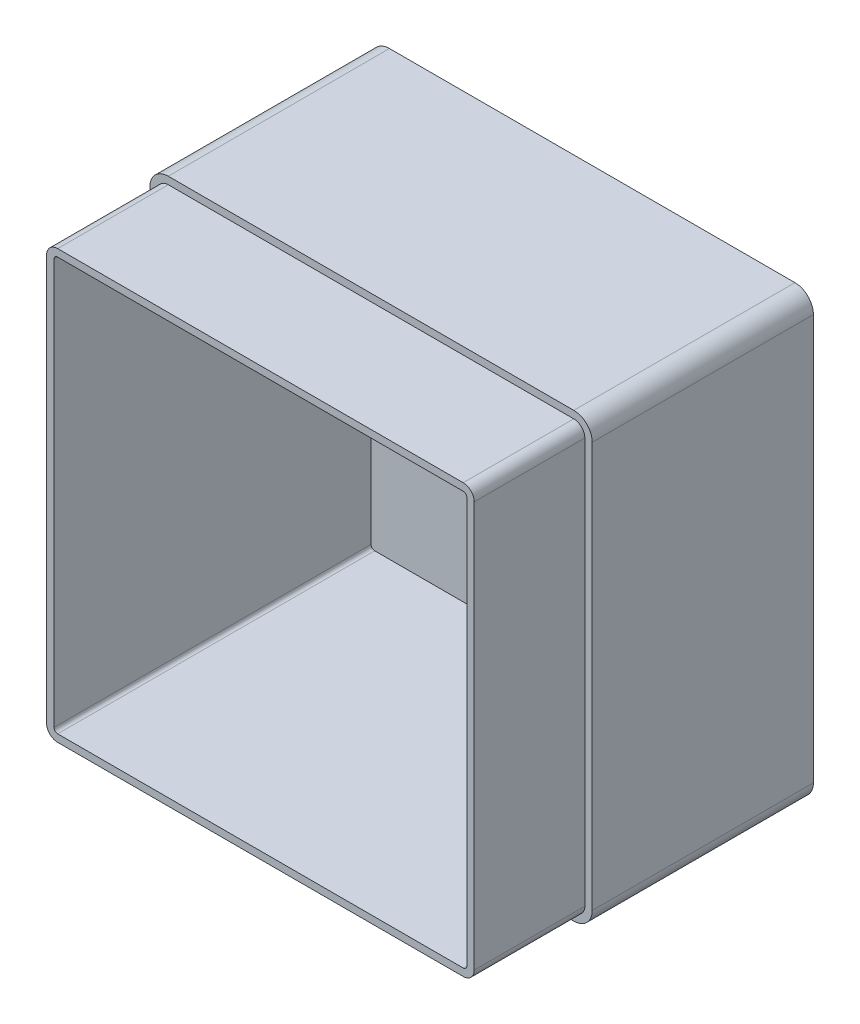
ISO-10303-21;
HEADER;
FILE_DESCRIPTION(('STEP AP214'),'2;1');
FILE_NAME('part.step','',(''),(''),'','','');
FILE_SCHEMA(('AUTOMOTIVE_DESIGN { 1 0 10303 214 1 1 1 1 }'));
ENDSEC;
DATA;
#1=APPLICATION_CONTEXT('core data for automotive mechanical design processes');
#2=APPLICATION_PROTOCOL_DEFINITION('international standard','automotive_design',2000,#1);
#3=PRODUCT_CONTEXT('',#1,'mechanical');
#4=PRODUCT('Part','Part','',(#3));
#5=PRODUCT_RELATED_PRODUCT_CATEGORY('part','',(#4));
#6=PRODUCT_DEFINITION_FORMATION('','',#4);
#7=PRODUCT_DEFINITION_CONTEXT('part definition',#1,'design');
#8=PRODUCT_DEFINITION('design','',#6,#7);
#9=PRODUCT_DEFINITION_SHAPE('','',#8);
#10=(LENGTH_UNIT() NAMED_UNIT(*) SI_UNIT(.MILLI.,.METRE.));
#11=(NAMED_UNIT(*) PLANE_ANGLE_UNIT() SI_UNIT($,.RADIAN.));
#12=(NAMED_UNIT(*) SI_UNIT($,.STERADIAN.) SOLID_ANGLE_UNIT());
#13=UNCERTAINTY_MEASURE_WITH_UNIT(LENGTH_MEASURE(1.E-05),#10,'distance_accuracy_value','');
#14=(GEOMETRIC_REPRESENTATION_CONTEXT(3) GLOBAL_UNCERTAINTY_ASSIGNED_CONTEXT((#13)) GLOBAL_UNIT_ASSIGNED_CONTEXT((#10,
#11,#12)) REPRESENTATION_CONTEXT('',''));
#15=CARTESIAN_POINT('',(0.,0.,0.));
#16=DIRECTION('',(0.,0.,1.));
#17=DIRECTION('',(1.,0.,0.));
#18=AXIS2_PLACEMENT_3D('',#15,#16,#17);
#19=CARTESIAN_POINT('',(0.,0.,90.));
#20=DIRECTION('',(0.,0.,1.));
#21=DIRECTION('',(1.,0.,0.));
#22=AXIS2_PLACEMENT_3D('',#19,#20,#21);
#23=PLANE('',#22);
#24=DIRECTION('',(1.,0.,0.));
#25=VECTOR('',#24,1.);
#26=CARTESIAN_POINT('',(-60.,-56.,90.));
#27=LINE('',#26,#25);
#28=CARTESIAN_POINT('',(-55.,-56.,90.));
#29=VERTEX_POINT('',#28);
#30=CARTESIAN_POINT('',(55.,-56.,90.));
#31=VERTEX_POINT('',#30);
#32=EDGE_CURVE('E292',#29,#31,#27,.T.);
#33=ORIENTED_EDGE('',*,*,#32,.F.);
#34=CARTESIAN_POINT('',(-55.,-55.,90.));
#35=DIRECTION('',(0.,0.,1.));
#36=DIRECTION('',(1.,0.,0.));
#37=AXIS2_PLACEMENT_3D('',#34,#35,#36);
#38=CIRCLE('',#37,1.);
#39=CARTESIAN_POINT('',(-56.,-55.,90.));
#40=VERTEX_POINT('',#39);
#41=EDGE_CURVE('E337',#40,#29,#38,.T.);
#42=ORIENTED_EDGE('',*,*,#41,.F.);
#43=DIRECTION('',(0.,-1.,0.));
#44=VECTOR('',#43,1.);
#45=CARTESIAN_POINT('',(-56.,60.,90.));
#46=LINE('',#45,#44);
#47=CARTESIAN_POINT('',(-56.,55.,90.));
#48=VERTEX_POINT('',#47);
#49=EDGE_CURVE('E335',#48,#40,#46,.T.);
#50=ORIENTED_EDGE('',*,*,#49,.F.);
#51=CARTESIAN_POINT('',(-55.,55.,90.));
#52=DIRECTION('',(0.,0.,1.));
#53=DIRECTION('',(1.,0.,0.));
#54=AXIS2_PLACEMENT_3D('',#51,#52,#53);
#55=CIRCLE('',#54,1.);
#56=CARTESIAN_POINT('',(-55.,56.,90.));
#57=VERTEX_POINT('',#56);
#58=EDGE_CURVE('E332',#57,#48,#55,.T.);
#59=ORIENTED_EDGE('',*,*,#58,.F.);
#60=DIRECTION('',(-1.,0.,0.));
#61=VECTOR('',#60,1.);
#62=CARTESIAN_POINT('',(-60.,56.,90.));
#63=LINE('',#62,#61);
#64=CARTESIAN_POINT('',(55.,56.,90.));
#65=VERTEX_POINT('',#64);
#66=EDGE_CURVE('E330',#65,#57,#63,.T.);
#67=ORIENTED_EDGE('',*,*,#66,.F.);
#68=CARTESIAN_POINT('',(55.,55.,90.));
#69=DIRECTION('',(0.,0.,1.));
#70=DIRECTION('',(1.,0.,0.));
#71=AXIS2_PLACEMENT_3D('',#68,#69,#70);
#72=CIRCLE('',#71,1.);
#73=CARTESIAN_POINT('',(56.,55.,90.));
#74=VERTEX_POINT('',#73);
#75=EDGE_CURVE('E327',#74,#65,#72,.T.);
#76=ORIENTED_EDGE('',*,*,#75,.F.);
#77=DIRECTION('',(0.,1.,0.));
#78=VECTOR('',#77,1.);
#79=CARTESIAN_POINT('',(56.,60.,90.));
#80=LINE('',#79,#78);
#81=CARTESIAN_POINT('',(56.,-55.,90.));
#82=VERTEX_POINT('',#81);
#83=EDGE_CURVE('E300',#82,#74,#80,.T.);
#84=ORIENTED_EDGE('',*,*,#83,.F.);
#85=CARTESIAN_POINT('',(55.,-55.,90.));
#86=DIRECTION('',(0.,0.,1.));
#87=DIRECTION('',(1.,0.,0.));
#88=AXIS2_PLACEMENT_3D('',#85,#86,#87);
#89=CIRCLE('',#88,1.);
#90=EDGE_CURVE('E320',#31,#82,#89,.T.);
#91=ORIENTED_EDGE('',*,*,#90,.F.);
#92=EDGE_LOOP('',(#33,#42,#50,#59,#67,#76,#84,#91));
#93=FACE_BOUND('',#92,.T.);
#94=DIRECTION('',(0.,1.,0.));
#95=VECTOR('',#94,1.);
#96=CARTESIAN_POINT('',(58.,-55.,90.));
#97=LINE('',#96,#95);
#98=CARTESIAN_POINT('',(58.,-55.,90.));
#99=VERTEX_POINT('',#98);
#100=CARTESIAN_POINT('',(58.,55.,90.));
#101=VERTEX_POINT('',#100);
#102=EDGE_CURVE('E220',#99,#101,#97,.T.);
#103=ORIENTED_EDGE('',*,*,#102,.T.);
#104=CARTESIAN_POINT('',(55.,55.,90.));
#105=DIRECTION('',(0.,0.,1.));
#106=DIRECTION('',(1.,0.,0.));
#107=AXIS2_PLACEMENT_3D('',#104,#105,#106);
#108=CIRCLE('',#107,3.);
#109=CARTESIAN_POINT('',(55.,58.,90.));
#110=VERTEX_POINT('',#109);
#111=EDGE_CURVE('E240',#101,#110,#108,.T.);
#112=ORIENTED_EDGE('',*,*,#111,.T.);
#113=DIRECTION('',(-1.,0.,0.));
#114=VECTOR('',#113,1.);
#115=CARTESIAN_POINT('',(55.,58.,90.));
#116=LINE('',#115,#114);
#117=CARTESIAN_POINT('',(-55.,58.,90.));
#118=VERTEX_POINT('',#117);
#119=EDGE_CURVE('E200',#110,#118,#116,.T.);
#120=ORIENTED_EDGE('',*,*,#119,.T.);
#121=CARTESIAN_POINT('',(-55.,55.,90.));
#122=DIRECTION('',(0.,0.,1.));
#123=DIRECTION('',(1.,0.,0.));
#124=AXIS2_PLACEMENT_3D('',#121,#122,#123);
#125=CIRCLE('',#124,2.99999999999999);
#126=CARTESIAN_POINT('',(-58.,55.,90.));
#127=VERTEX_POINT('',#126);
#128=EDGE_CURVE('E48',#118,#127,#125,.T.);
#129=ORIENTED_EDGE('',*,*,#128,.T.);
#130=DIRECTION('',(0.,-1.,0.));
#131=VECTOR('',#130,1.);
#132=CARTESIAN_POINT('',(-58.,55.,90.));
#133=LINE('',#132,#131);
#134=CARTESIAN_POINT('',(-58.,-55.,90.));
#135=VERTEX_POINT('',#134);
#136=EDGE_CURVE('E244',#127,#135,#133,.T.);
#137=ORIENTED_EDGE('',*,*,#136,.T.);
#138=CARTESIAN_POINT('',(-55.,-55.,90.));
#139=DIRECTION('',(0.,0.,1.));
#140=DIRECTION('',(1.,0.,0.));
#141=AXIS2_PLACEMENT_3D('',#138,#139,#140);
#142=CIRCLE('',#141,3.);
#143=CARTESIAN_POINT('',(-55.,-58.,90.));
#144=VERTEX_POINT('',#143);
#145=EDGE_CURVE('E247',#135,#144,#142,.T.);
#146=ORIENTED_EDGE('',*,*,#145,.T.);
#147=DIRECTION('',(1.,0.,0.));
#148=VECTOR('',#147,1.);
#149=CARTESIAN_POINT('',(-55.,-58.,90.));
#150=LINE('',#149,#148);
#151=CARTESIAN_POINT('',(55.,-58.,90.));
#152=VERTEX_POINT('',#151);
#153=EDGE_CURVE('E250',#144,#152,#150,.T.);
#154=ORIENTED_EDGE('',*,*,#153,.T.);
#155=CARTESIAN_POINT('',(55.,-55.,90.));
#156=DIRECTION('',(0.,0.,1.));
#157=DIRECTION('',(1.,0.,0.));
#158=AXIS2_PLACEMENT_3D('',#155,#156,#157);
#159=CIRCLE('',#158,3.);
#160=EDGE_CURVE('E223',#152,#99,#159,.T.);
#161=ORIENTED_EDGE('',*,*,#160,.T.);
#162=EDGE_LOOP('',(#103,#112,#120,#129,#137,#146,#154,#161));
#163=FACE_BOUND('',#162,.T.);
#164=ADVANCED_FACE('F33',(#93,#163),#23,.T.);
#165=CARTESIAN_POINT('',(56.,60.,90.));
#166=DIRECTION('',(-1.,0.,0.));
#167=DIRECTION('',(0.,-1.,0.));
#168=AXIS2_PLACEMENT_3D('',#165,#166,#167);
#169=PLANE('',#168);
#170=ORIENTED_EDGE('',*,*,#83,.T.);
#171=DIRECTION('',(0.,0.,1.));
#172=VECTOR('',#171,1.);
#173=CARTESIAN_POINT('',(56.,55.,90.));
#174=LINE('',#173,#172);
#175=CARTESIAN_POINT('',(56.,55.,4.));
#176=VERTEX_POINT('',#175);
#177=EDGE_CURVE('E287',#176,#74,#174,.T.);
#178=ORIENTED_EDGE('',*,*,#177,.F.);
#179=DIRECTION('',(0.,1.,0.));
#180=VECTOR('',#179,1.);
#181=CARTESIAN_POINT('',(56.,60.,4.));
#182=LINE('',#181,#180);
#183=CARTESIAN_POINT('',(56.,-55.,4.));
#184=VERTEX_POINT('',#183);
#185=EDGE_CURVE('E282',#184,#176,#182,.T.);
#186=ORIENTED_EDGE('',*,*,#185,.F.);
#187=DIRECTION('',(0.,0.,1.));
#188=VECTOR('',#187,1.);
#189=CARTESIAN_POINT('',(56.,-55.,90.));
#190=LINE('',#189,#188);
#191=EDGE_CURVE('E283',#82,#184,#190,.F.);
#192=ORIENTED_EDGE('',*,*,#191,.F.);
#193=EDGE_LOOP('',(#170,#178,#186,#192));
#194=FACE_BOUND('',#193,.T.);
#195=ADVANCED_FACE('F423',(#194),#169,.T.);
#196=CARTESIAN_POINT('',(-60.,56.,90.));
#197=DIRECTION('',(0.,-1.,0.));
#198=DIRECTION('',(1.,0.,0.));
#199=AXIS2_PLACEMENT_3D('',#196,#197,#198);
#200=PLANE('',#199);
#201=DIRECTION('',(-1.,0.,0.));
#202=VECTOR('',#201,1.);
#203=CARTESIAN_POINT('',(-60.,56.,4.));
#204=LINE('',#203,#202);
#205=CARTESIAN_POINT('',(55.,56.,4.));
#206=VERTEX_POINT('',#205);
#207=CARTESIAN_POINT('',(-55.,56.,4.));
#208=VERTEX_POINT('',#207);
#209=EDGE_CURVE('E290',#206,#208,#204,.T.);
#210=ORIENTED_EDGE('',*,*,#209,.F.);
#211=DIRECTION('',(0.,0.,1.));
#212=VECTOR('',#211,1.);
#213=CARTESIAN_POINT('',(55.,56.,90.));
#214=LINE('',#213,#212);
#215=EDGE_CURVE('E313',#65,#206,#214,.F.);
#216=ORIENTED_EDGE('',*,*,#215,.F.);
#217=ORIENTED_EDGE('',*,*,#66,.T.);
#218=DIRECTION('',(0.,0.,1.));
#219=VECTOR('',#218,1.);
#220=CARTESIAN_POINT('',(-55.,56.,90.));
#221=LINE('',#220,#219);
#222=EDGE_CURVE('E310',#208,#57,#221,.T.);
#223=ORIENTED_EDGE('',*,*,#222,.F.);
#224=EDGE_LOOP('',(#210,#216,#217,#223));
#225=FACE_BOUND('',#224,.T.);
#226=ADVANCED_FACE('F429',(#225),#200,.T.);
#227=CARTESIAN_POINT('',(-56.,60.,90.));
#228=DIRECTION('',(1.,0.,0.));
#229=DIRECTION('',(0.,1.,0.));
#230=AXIS2_PLACEMENT_3D('',#227,#228,#229);
#231=PLANE('',#230);
#232=DIRECTION('',(0.,-1.,0.));
#233=VECTOR('',#232,1.);
#234=CARTESIAN_POINT('',(-56.,60.,4.));
#235=LINE('',#234,#233);
#236=CARTESIAN_POINT('',(-56.,55.,4.));
#237=VERTEX_POINT('',#236);
#238=CARTESIAN_POINT('',(-56.,-55.,4.));
#239=VERTEX_POINT('',#238);
#240=EDGE_CURVE('E301',#237,#239,#235,.T.);
#241=ORIENTED_EDGE('',*,*,#240,.F.);
#242=DIRECTION('',(0.,0.,1.));
#243=VECTOR('',#242,1.);
#244=CARTESIAN_POINT('',(-56.,55.,90.));
#245=LINE('',#244,#243);
#246=EDGE_CURVE('E317',#48,#237,#245,.F.);
#247=ORIENTED_EDGE('',*,*,#246,.F.);
#248=ORIENTED_EDGE('',*,*,#49,.T.);
#249=DIRECTION('',(0.,0.,1.));
#250=VECTOR('',#249,1.);
#251=CARTESIAN_POINT('',(-56.,-55.,90.));
#252=LINE('',#251,#250);
#253=EDGE_CURVE('E316',#239,#40,#252,.T.);
#254=ORIENTED_EDGE('',*,*,#253,.F.);
#255=EDGE_LOOP('',(#241,#247,#248,#254));
#256=FACE_BOUND('',#255,.T.);
#257=ADVANCED_FACE('F618',(#256),#231,.T.);
#258=CARTESIAN_POINT('',(-60.,-56.,90.));
#259=DIRECTION('',(0.,1.,0.));
#260=DIRECTION('',(-1.,0.,0.));
#261=AXIS2_PLACEMENT_3D('',#258,#259,#260);
#262=PLANE('',#261);
#263=DIRECTION('',(1.,0.,0.));
#264=VECTOR('',#263,1.);
#265=CARTESIAN_POINT('',(-60.,-56.,4.));
#266=LINE('',#265,#264);
#267=CARTESIAN_POINT('',(-55.,-56.,4.));
#268=VERTEX_POINT('',#267);
#269=CARTESIAN_POINT('',(55.,-56.,4.));
#270=VERTEX_POINT('',#269);
#271=EDGE_CURVE('E297',#268,#270,#266,.T.);
#272=ORIENTED_EDGE('',*,*,#271,.F.);
#273=DIRECTION('',(0.,0.,1.));
#274=VECTOR('',#273,1.);
#275=CARTESIAN_POINT('',(-55.,-56.,90.));
#276=LINE('',#275,#274);
#277=EDGE_CURVE('E295',#29,#268,#276,.F.);
#278=ORIENTED_EDGE('',*,*,#277,.F.);
#279=ORIENTED_EDGE('',*,*,#32,.T.);
#280=DIRECTION('',(0.,0.,1.));
#281=VECTOR('',#280,1.);
#282=CARTESIAN_POINT('',(55.,-56.,90.));
#283=LINE('',#282,#281);
#284=EDGE_CURVE('E325',#270,#31,#283,.T.);
#285=ORIENTED_EDGE('',*,*,#284,.F.);
#286=EDGE_LOOP('',(#272,#278,#279,#285));
#287=FACE_BOUND('',#286,.T.);
#288=ADVANCED_FACE('F610',(#287),#262,.T.);
#289=CARTESIAN_POINT('',(0.,0.,4.));
#290=DIRECTION('',(0.,0.,1.));
#291=DIRECTION('',(1.,0.,0.));
#292=AXIS2_PLACEMENT_3D('',#289,#290,#291);
#293=PLANE('',#292);
#294=ORIENTED_EDGE('',*,*,#185,.T.);
#295=CARTESIAN_POINT('',(55.,55.,4.));
#296=DIRECTION('',(0.,0.,1.));
#297=DIRECTION('',(1.,0.,0.));
#298=AXIS2_PLACEMENT_3D('',#295,#296,#297);
#299=CIRCLE('',#298,1.);
#300=EDGE_CURVE('E286',#206,#176,#299,.F.);
#301=ORIENTED_EDGE('',*,*,#300,.F.);
#302=ORIENTED_EDGE('',*,*,#209,.T.);
#303=CARTESIAN_POINT('',(-55.,55.,4.));
#304=DIRECTION('',(0.,0.,1.));
#305=DIRECTION('',(1.,0.,0.));
#306=AXIS2_PLACEMENT_3D('',#303,#304,#305);
#307=CIRCLE('',#306,1.);
#308=EDGE_CURVE('E303',#237,#208,#307,.F.);
#309=ORIENTED_EDGE('',*,*,#308,.F.);
#310=ORIENTED_EDGE('',*,*,#240,.T.);
#311=CARTESIAN_POINT('',(-55.,-55.,4.));
#312=DIRECTION('',(0.,0.,1.));
#313=DIRECTION('',(1.,0.,0.));
#314=AXIS2_PLACEMENT_3D('',#311,#312,#313);
#315=CIRCLE('',#314,1.);
#316=EDGE_CURVE('E296',#268,#239,#315,.F.);
#317=ORIENTED_EDGE('',*,*,#316,.F.);
#318=ORIENTED_EDGE('',*,*,#271,.T.);
#319=CARTESIAN_POINT('',(55.,-55.,4.));
#320=DIRECTION('',(0.,0.,1.));
#321=DIRECTION('',(1.,0.,0.));
#322=AXIS2_PLACEMENT_3D('',#319,#320,#321);
#323=CIRCLE('',#322,1.);
#324=EDGE_CURVE('E293',#184,#270,#323,.F.);
#325=ORIENTED_EDGE('',*,*,#324,.F.);
#326=EDGE_LOOP('',(#294,#301,#302,#309,#310,#317,#318,#325));
#327=FACE_BOUND('',#326,.T.);
#328=ADVANCED_FACE('F602',(#327),#293,.T.);
#329=CARTESIAN_POINT('',(55.,-55.,90.));
#330=DIRECTION('',(0.,0.,-1.));
#331=DIRECTION('',(-1.,0.,0.));
#332=AXIS2_PLACEMENT_3D('',#329,#330,#331);
#333=CYLINDRICAL_SURFACE('',#332,1.);
#334=ORIENTED_EDGE('',*,*,#90,.T.);
#335=ORIENTED_EDGE('',*,*,#191,.T.);
#336=ORIENTED_EDGE('',*,*,#324,.T.);
#337=ORIENTED_EDGE('',*,*,#284,.T.);
#338=EDGE_LOOP('',(#334,#335,#336,#337));
#339=FACE_BOUND('',#338,.T.);
#340=ADVANCED_FACE('F594',(#339),#333,.F.);
#341=CARTESIAN_POINT('',(-55.,-55.,90.));
#342=DIRECTION('',(0.,0.,-1.));
#343=DIRECTION('',(-1.,0.,0.));
#344=AXIS2_PLACEMENT_3D('',#341,#342,#343);
#345=CYLINDRICAL_SURFACE('',#344,1.);
#346=ORIENTED_EDGE('',*,*,#41,.T.);
#347=ORIENTED_EDGE('',*,*,#277,.T.);
#348=ORIENTED_EDGE('',*,*,#316,.T.);
#349=ORIENTED_EDGE('',*,*,#253,.T.);
#350=EDGE_LOOP('',(#346,#347,#348,#349));
#351=FACE_BOUND('',#350,.T.);
#352=ADVANCED_FACE('F587',(#351),#345,.F.);
#353=CARTESIAN_POINT('',(-55.,55.,90.));
#354=DIRECTION('',(0.,0.,-1.));
#355=DIRECTION('',(-1.,0.,0.));
#356=AXIS2_PLACEMENT_3D('',#353,#354,#355);
#357=CYLINDRICAL_SURFACE('',#356,1.);
#358=ORIENTED_EDGE('',*,*,#58,.T.);
#359=ORIENTED_EDGE('',*,*,#246,.T.);
#360=ORIENTED_EDGE('',*,*,#308,.T.);
#361=ORIENTED_EDGE('',*,*,#222,.T.);
#362=EDGE_LOOP('',(#358,#359,#360,#361));
#363=FACE_BOUND('',#362,.T.);
#364=ADVANCED_FACE('F581',(#363),#357,.F.);
#365=CARTESIAN_POINT('',(55.,55.,90.));
#366=DIRECTION('',(0.,0.,-1.));
#367=DIRECTION('',(-1.,0.,0.));
#368=AXIS2_PLACEMENT_3D('',#365,#366,#367);
#369=CYLINDRICAL_SURFACE('',#368,1.);
#370=ORIENTED_EDGE('',*,*,#75,.T.);
#371=ORIENTED_EDGE('',*,*,#215,.T.);
#372=ORIENTED_EDGE('',*,*,#300,.T.);
#373=ORIENTED_EDGE('',*,*,#177,.T.);
#374=EDGE_LOOP('',(#370,#371,#372,#373));
#375=FACE_BOUND('',#374,.T.);
#376=ADVANCED_FACE('F436',(#375),#369,.F.);
#377=CARTESIAN_POINT('',(-55.,-55.,60.));
#378=DIRECTION('',(0.,0.,1.));
#379=DIRECTION('',(1.,0.,0.));
#380=AXIS2_PLACEMENT_3D('',#377,#378,#379);
#381=PLANE('',#380);
#382=DIRECTION('',(0.,1.,0.));
#383=VECTOR('',#382,1.);
#384=CARTESIAN_POINT('',(58.,-55.,60.));
#385=LINE('',#384,#383);
#386=CARTESIAN_POINT('',(58.,-55.,60.));
#387=VERTEX_POINT('',#386);
#388=CARTESIAN_POINT('',(58.,55.,60.));
#389=VERTEX_POINT('',#388);
#390=EDGE_CURVE('E206',#387,#389,#385,.T.);
#391=ORIENTED_EDGE('',*,*,#390,.F.);
#392=CARTESIAN_POINT('',(55.,-55.,60.));
#393=DIRECTION('',(0.,0.,1.));
#394=DIRECTION('',(1.,0.,0.));
#395=AXIS2_PLACEMENT_3D('',#392,#393,#394);
#396=CIRCLE('',#395,3.);
#397=CARTESIAN_POINT('',(55.,-58.,60.));
#398=VERTEX_POINT('',#397);
#399=EDGE_CURVE('E236',#398,#387,#396,.T.);
#400=ORIENTED_EDGE('',*,*,#399,.F.);
#401=DIRECTION('',(1.,0.,0.));
#402=VECTOR('',#401,1.);
#403=CARTESIAN_POINT('',(-55.,-58.,60.));
#404=LINE('',#403,#402);
#405=CARTESIAN_POINT('',(-55.,-58.,60.));
#406=VERTEX_POINT('',#405);
#407=EDGE_CURVE('E233',#406,#398,#404,.T.);
#408=ORIENTED_EDGE('',*,*,#407,.F.);
#409=CARTESIAN_POINT('',(-55.,-55.,60.));
#410=DIRECTION('',(0.,0.,1.));
#411=DIRECTION('',(1.,0.,0.));
#412=AXIS2_PLACEMENT_3D('',#409,#410,#411);
#413=CIRCLE('',#412,3.);
#414=CARTESIAN_POINT('',(-58.,-55.,60.));
#415=VERTEX_POINT('',#414);
#416=EDGE_CURVE('E230',#415,#406,#413,.T.);
#417=ORIENTED_EDGE('',*,*,#416,.F.);
#418=DIRECTION('',(0.,-1.,0.));
#419=VECTOR('',#418,1.);
#420=CARTESIAN_POINT('',(-58.,55.,60.));
#421=LINE('',#420,#419);
#422=CARTESIAN_POINT('',(-58.,55.,60.));
#423=VERTEX_POINT('',#422);
#424=EDGE_CURVE('E227',#423,#415,#421,.T.);
#425=ORIENTED_EDGE('',*,*,#424,.F.);
#426=CARTESIAN_POINT('',(-55.,55.,60.));
#427=DIRECTION('',(0.,0.,1.));
#428=DIRECTION('',(1.,0.,0.));
#429=AXIS2_PLACEMENT_3D('',#426,#427,#428);
#430=CIRCLE('',#429,2.99999999999999);
#431=CARTESIAN_POINT('',(-55.,58.,60.));
#432=VERTEX_POINT('',#431);
#433=EDGE_CURVE('E216',#432,#423,#430,.T.);
#434=ORIENTED_EDGE('',*,*,#433,.F.);
#435=DIRECTION('',(-1.,0.,0.));
#436=VECTOR('',#435,1.);
#437=CARTESIAN_POINT('',(55.,58.,60.));
#438=LINE('',#437,#436);
#439=CARTESIAN_POINT('',(55.,58.,60.));
#440=VERTEX_POINT('',#439);
#441=EDGE_CURVE('E198',#440,#432,#438,.T.);
#442=ORIENTED_EDGE('',*,*,#441,.F.);
#443=CARTESIAN_POINT('',(55.,55.,60.));
#444=DIRECTION('',(0.,0.,1.));
#445=DIRECTION('',(1.,0.,0.));
#446=AXIS2_PLACEMENT_3D('',#443,#444,#445);
#447=CIRCLE('',#446,3.);
#448=EDGE_CURVE('E212',#389,#440,#447,.T.);
#449=ORIENTED_EDGE('',*,*,#448,.F.);
#450=EDGE_LOOP('',(#391,#400,#408,#417,#425,#434,#442,#449));
#451=FACE_BOUND('',#450,.T.);
#452=CARTESIAN_POINT('',(-55.,-55.,60.));
#453=DIRECTION('',(0.,0.,1.));
#454=DIRECTION('',(1.,0.,0.));
#455=AXIS2_PLACEMENT_3D('',#452,#453,#454);
#456=CIRCLE('',#455,5.);
#457=CARTESIAN_POINT('',(-60.,-55.,60.));
#458=VERTEX_POINT('',#457);
#459=CARTESIAN_POINT('',(-55.,-60.,60.));
#460=VERTEX_POINT('',#459);
#461=EDGE_CURVE('E256',#458,#460,#456,.T.);
#462=ORIENTED_EDGE('',*,*,#461,.T.);
#463=DIRECTION('',(1.,0.,0.));
#464=VECTOR('',#463,1.);
#465=CARTESIAN_POINT('',(-55.,-60.,60.));
#466=LINE('',#465,#464);
#467=CARTESIAN_POINT('',(55.,-60.,60.));
#468=VERTEX_POINT('',#467);
#469=EDGE_CURVE('E269',#460,#468,#466,.T.);
#470=ORIENTED_EDGE('',*,*,#469,.T.);
#471=CARTESIAN_POINT('',(55.,-55.,60.));
#472=DIRECTION('',(0.,0.,1.));
#473=DIRECTION('',(1.,0.,0.));
#474=AXIS2_PLACEMENT_3D('',#471,#472,#473);
#475=CIRCLE('',#474,4.99999999999999);
#476=CARTESIAN_POINT('',(60.,-55.,60.));
#477=VERTEX_POINT('',#476);
#478=EDGE_CURVE('E271',#468,#477,#475,.T.);
#479=ORIENTED_EDGE('',*,*,#478,.T.);
#480=DIRECTION('',(0.,1.,0.));
#481=VECTOR('',#480,1.);
#482=CARTESIAN_POINT('',(60.,-55.,60.));
#483=LINE('',#482,#481);
#484=CARTESIAN_POINT('',(60.,55.,60.));
#485=VERTEX_POINT('',#484);
#486=EDGE_CURVE('E56',#477,#485,#483,.T.);
#487=ORIENTED_EDGE('',*,*,#486,.T.);
#488=CARTESIAN_POINT('',(55.,55.,60.));
#489=DIRECTION('',(0.,0.,1.));
#490=DIRECTION('',(1.,0.,0.));
#491=AXIS2_PLACEMENT_3D('',#488,#489,#490);
#492=CIRCLE('',#491,5.);
#493=CARTESIAN_POINT('',(55.,60.,60.));
#494=VERTEX_POINT('',#493);
#495=EDGE_CURVE('E274',#485,#494,#492,.T.);
#496=ORIENTED_EDGE('',*,*,#495,.T.);
#497=DIRECTION('',(-1.,0.,0.));
#498=VECTOR('',#497,1.);
#499=CARTESIAN_POINT('',(55.,60.,60.));
#500=LINE('',#499,#498);
#501=CARTESIAN_POINT('',(-55.,60.,60.));
#502=VERTEX_POINT('',#501);
#503=EDGE_CURVE('E276',#494,#502,#500,.T.);
#504=ORIENTED_EDGE('',*,*,#503,.T.);
#505=CARTESIAN_POINT('',(-55.,55.,60.));
#506=DIRECTION('',(0.,0.,1.));
#507=DIRECTION('',(1.,0.,0.));
#508=AXIS2_PLACEMENT_3D('',#505,#506,#507);
#509=CIRCLE('',#508,5.);
#510=CARTESIAN_POINT('',(-60.,55.,60.));
#511=VERTEX_POINT('',#510);
#512=EDGE_CURVE('E278',#502,#511,#509,.T.);
#513=ORIENTED_EDGE('',*,*,#512,.T.);
#514=DIRECTION('',(0.,-1.,0.));
#515=VECTOR('',#514,1.);
#516=CARTESIAN_POINT('',(-60.,55.,60.));
#517=LINE('',#516,#515);
#518=EDGE_CURVE('E280',#511,#458,#517,.T.);
#519=ORIENTED_EDGE('',*,*,#518,.T.);
#520=EDGE_LOOP('',(#462,#470,#479,#487,#496,#504,#513,#519));
#521=FACE_BOUND('',#520,.T.);
#522=ADVANCED_FACE('F211',(#451,#521),#381,.T.);
#523=CARTESIAN_POINT('',(55.,55.,60.));
#524=DIRECTION('',(0.,0.,1.));
#525=DIRECTION('',(1.,0.,0.));
#526=AXIS2_PLACEMENT_3D('',#523,#524,#525);
#527=CYLINDRICAL_SURFACE('',#526,3.);
#528=ORIENTED_EDGE('',*,*,#111,.F.);
#529=DIRECTION('',(0.,0.,1.));
#530=VECTOR('',#529,1.);
#531=CARTESIAN_POINT('',(58.,55.,60.));
#532=LINE('',#531,#530);
#533=EDGE_CURVE('E219',#389,#101,#532,.T.);
#534=ORIENTED_EDGE('',*,*,#533,.F.);
#535=ORIENTED_EDGE('',*,*,#448,.T.);
#536=DIRECTION('',(0.,0.,1.));
#537=VECTOR('',#536,1.);
#538=CARTESIAN_POINT('',(55.,58.,60.));
#539=LINE('',#538,#537);
#540=EDGE_CURVE('E195',#440,#110,#539,.T.);
#541=ORIENTED_EDGE('',*,*,#540,.T.);
#542=EDGE_LOOP('',(#528,#534,#535,#541));
#543=FACE_BOUND('',#542,.T.);
#544=ADVANCED_FACE('F218',(#543),#527,.T.);
#545=CARTESIAN_POINT('',(58.,-55.,60.));
#546=DIRECTION('',(1.,0.,0.));
#547=DIRECTION('',(0.,0.,-1.));
#548=AXIS2_PLACEMENT_3D('',#545,#546,#547);
#549=PLANE('',#548);
#550=ORIENTED_EDGE('',*,*,#102,.F.);
#551=DIRECTION('',(0.,0.,1.));
#552=VECTOR('',#551,1.);
#553=CARTESIAN_POINT('',(58.,-55.,60.));
#554=LINE('',#553,#552);
#555=EDGE_CURVE('E257',#387,#99,#554,.T.);
#556=ORIENTED_EDGE('',*,*,#555,.F.);
#557=ORIENTED_EDGE('',*,*,#390,.T.);
#558=ORIENTED_EDGE('',*,*,#533,.T.);
#559=EDGE_LOOP('',(#550,#556,#557,#558));
#560=FACE_BOUND('',#559,.T.);
#561=ADVANCED_FACE('F509',(#560),#549,.T.);
#562=CARTESIAN_POINT('',(55.,-55.,60.));
#563=DIRECTION('',(0.,0.,1.));
#564=DIRECTION('',(1.,0.,0.));
#565=AXIS2_PLACEMENT_3D('',#562,#563,#564);
#566=CYLINDRICAL_SURFACE('',#565,3.);
#567=ORIENTED_EDGE('',*,*,#160,.F.);
#568=DIRECTION('',(0.,0.,1.));
#569=VECTOR('',#568,1.);
#570=CARTESIAN_POINT('',(55.,-58.,60.));
#571=LINE('',#570,#569);
#572=EDGE_CURVE('E259',#398,#152,#571,.T.);
#573=ORIENTED_EDGE('',*,*,#572,.F.);
#574=ORIENTED_EDGE('',*,*,#399,.T.);
#575=ORIENTED_EDGE('',*,*,#555,.T.);
#576=EDGE_LOOP('',(#567,#573,#574,#575));
#577=FACE_BOUND('',#576,.T.);
#578=ADVANCED_FACE('F517',(#577),#566,.T.);
#579=CARTESIAN_POINT('',(-55.,-58.,60.));
#580=DIRECTION('',(0.,-1.,0.));
#581=DIRECTION('',(0.,0.,-1.));
#582=AXIS2_PLACEMENT_3D('',#579,#580,#581);
#583=PLANE('',#582);
#584=ORIENTED_EDGE('',*,*,#153,.F.);
#585=DIRECTION('',(0.,0.,1.));
#586=VECTOR('',#585,1.);
#587=CARTESIAN_POINT('',(-55.,-58.,60.));
#588=LINE('',#587,#586);
#589=EDGE_CURVE('E261',#406,#144,#588,.T.);
#590=ORIENTED_EDGE('',*,*,#589,.F.);
#591=ORIENTED_EDGE('',*,*,#407,.T.);
#592=ORIENTED_EDGE('',*,*,#572,.T.);
#593=EDGE_LOOP('',(#584,#590,#591,#592));
#594=FACE_BOUND('',#593,.T.);
#595=ADVANCED_FACE('F526',(#594),#583,.T.);
#596=CARTESIAN_POINT('',(-55.,-55.,60.));
#597=DIRECTION('',(0.,0.,1.));
#598=DIRECTION('',(1.,0.,0.));
#599=AXIS2_PLACEMENT_3D('',#596,#597,#598);
#600=CYLINDRICAL_SURFACE('',#599,3.);
#601=ORIENTED_EDGE('',*,*,#145,.F.);
#602=DIRECTION('',(0.,0.,1.));
#603=VECTOR('',#602,1.);
#604=CARTESIAN_POINT('',(-58.,-55.,60.));
#605=LINE('',#604,#603);
#606=EDGE_CURVE('E263',#415,#135,#605,.T.);
#607=ORIENTED_EDGE('',*,*,#606,.F.);
#608=ORIENTED_EDGE('',*,*,#416,.T.);
#609=ORIENTED_EDGE('',*,*,#589,.T.);
#610=EDGE_LOOP('',(#601,#607,#608,#609));
#611=FACE_BOUND('',#610,.T.);
#612=ADVANCED_FACE('F535',(#611),#600,.T.);
#613=CARTESIAN_POINT('',(-58.,55.,60.));
#614=DIRECTION('',(-1.,0.,0.));
#615=DIRECTION('',(0.,0.,1.));
#616=AXIS2_PLACEMENT_3D('',#613,#614,#615);
#617=PLANE('',#616);
#618=ORIENTED_EDGE('',*,*,#136,.F.);
#619=DIRECTION('',(0.,0.,1.));
#620=VECTOR('',#619,1.);
#621=CARTESIAN_POINT('',(-58.,55.,60.));
#622=LINE('',#621,#620);
#623=EDGE_CURVE('E265',#423,#127,#622,.T.);
#624=ORIENTED_EDGE('',*,*,#623,.F.);
#625=ORIENTED_EDGE('',*,*,#424,.T.);
#626=ORIENTED_EDGE('',*,*,#606,.T.);
#627=EDGE_LOOP('',(#618,#624,#625,#626));
#628=FACE_BOUND('',#627,.T.);
#629=ADVANCED_FACE('F544',(#628),#617,.T.);
#630=CARTESIAN_POINT('',(-55.,55.,60.));
#631=DIRECTION('',(0.,0.,1.));
#632=DIRECTION('',(1.,0.,0.));
#633=AXIS2_PLACEMENT_3D('',#630,#631,#632);
#634=CYLINDRICAL_SURFACE('',#633,2.99999999999999);
#635=ORIENTED_EDGE('',*,*,#128,.F.);
#636=DIRECTION('',(0.,0.,1.));
#637=VECTOR('',#636,1.);
#638=CARTESIAN_POINT('',(-55.,58.,60.));
#639=LINE('',#638,#637);
#640=EDGE_CURVE('E205',#432,#118,#639,.T.);
#641=ORIENTED_EDGE('',*,*,#640,.F.);
#642=ORIENTED_EDGE('',*,*,#433,.T.);
#643=ORIENTED_EDGE('',*,*,#623,.T.);
#644=EDGE_LOOP('',(#635,#641,#642,#643));
#645=FACE_BOUND('',#644,.T.);
#646=ADVANCED_FACE('F553',(#645),#634,.T.);
#647=CARTESIAN_POINT('',(55.,58.,60.));
#648=DIRECTION('',(0.,1.,0.));
#649=DIRECTION('',(0.,0.,1.));
#650=AXIS2_PLACEMENT_3D('',#647,#648,#649);
#651=PLANE('',#650);
#652=ORIENTED_EDGE('',*,*,#119,.F.);
#653=ORIENTED_EDGE('',*,*,#540,.F.);
#654=ORIENTED_EDGE('',*,*,#441,.T.);
#655=ORIENTED_EDGE('',*,*,#640,.T.);
#656=EDGE_LOOP('',(#652,#653,#654,#655));
#657=FACE_BOUND('',#656,.T.);
#658=ADVANCED_FACE('F197',(#657),#651,.T.);
#659=CARTESIAN_POINT('',(0.,0.,0.));
#660=DIRECTION('',(0.,0.,1.));
#661=DIRECTION('',(1.,0.,0.));
#662=AXIS2_PLACEMENT_3D('',#659,#660,#661);
#663=PLANE('',#662);
#664=DIRECTION('',(0.,1.,0.));
#665=VECTOR('',#664,1.);
#666=CARTESIAN_POINT('',(60.,60.,0.));
#667=LINE('',#666,#665);
#668=CARTESIAN_POINT('',(60.,-55.,0.));
#669=VERTEX_POINT('',#668);
#670=CARTESIAN_POINT('',(60.,55.,0.));
#671=VERTEX_POINT('',#670);
#672=EDGE_CURVE('E312',#669,#671,#667,.T.);
#673=ORIENTED_EDGE('',*,*,#672,.F.);
#674=CARTESIAN_POINT('',(55.,-55.,0.));
#675=DIRECTION('',(0.,0.,1.));
#676=DIRECTION('',(1.,0.,0.));
#677=AXIS2_PLACEMENT_3D('',#674,#675,#676);
#678=CIRCLE('',#677,5.);
#679=CARTESIAN_POINT('',(55.,-60.,0.));
#680=VERTEX_POINT('',#679);
#681=EDGE_CURVE('E365',#669,#680,#678,.F.);
#682=ORIENTED_EDGE('',*,*,#681,.T.);
#683=DIRECTION('',(1.,0.,0.));
#684=VECTOR('',#683,1.);
#685=CARTESIAN_POINT('',(-60.,-60.,0.));
#686=LINE('',#685,#684);
#687=CARTESIAN_POINT('',(-55.,-60.,0.));
#688=VERTEX_POINT('',#687);
#689=EDGE_CURVE('E351',#688,#680,#686,.T.);
#690=ORIENTED_EDGE('',*,*,#689,.F.);
#691=CARTESIAN_POINT('',(-55.,-55.,0.));
#692=DIRECTION('',(0.,0.,1.));
#693=DIRECTION('',(1.,0.,0.));
#694=AXIS2_PLACEMENT_3D('',#691,#692,#693);
#695=CIRCLE('',#694,5.);
#696=CARTESIAN_POINT('',(-60.,-55.,0.));
#697=VERTEX_POINT('',#696);
#698=EDGE_CURVE('E363',#688,#697,#695,.F.);
#699=ORIENTED_EDGE('',*,*,#698,.T.);
#700=DIRECTION('',(0.,-1.,0.));
#701=VECTOR('',#700,1.);
#702=CARTESIAN_POINT('',(-60.,60.,0.));
#703=LINE('',#702,#701);
#704=CARTESIAN_POINT('',(-60.,55.,0.));
#705=VERTEX_POINT('',#704);
#706=EDGE_CURVE('E348',#705,#697,#703,.T.);
#707=ORIENTED_EDGE('',*,*,#706,.F.);
#708=CARTESIAN_POINT('',(-55.,55.,0.));
#709=DIRECTION('',(0.,0.,1.));
#710=DIRECTION('',(1.,0.,0.));
#711=AXIS2_PLACEMENT_3D('',#708,#709,#710);
#712=CIRCLE('',#711,5.);
#713=CARTESIAN_POINT('',(-55.,60.,0.));
#714=VERTEX_POINT('',#713);
#715=EDGE_CURVE('E361',#705,#714,#712,.F.);
#716=ORIENTED_EDGE('',*,*,#715,.T.);
#717=DIRECTION('',(-1.,0.,0.));
#718=VECTOR('',#717,1.);
#719=CARTESIAN_POINT('',(-60.,60.,0.));
#720=LINE('',#719,#718);
#721=CARTESIAN_POINT('',(55.,60.,0.));
#722=VERTEX_POINT('',#721);
#723=EDGE_CURVE('E345',#722,#714,#720,.T.);
#724=ORIENTED_EDGE('',*,*,#723,.F.);
#725=CARTESIAN_POINT('',(55.,55.,0.));
#726=DIRECTION('',(0.,0.,1.));
#727=DIRECTION('',(1.,0.,0.));
#728=AXIS2_PLACEMENT_3D('',#725,#726,#727);
#729=CIRCLE('',#728,5.);
#730=EDGE_CURVE('E359',#722,#671,#729,.F.);
#731=ORIENTED_EDGE('',*,*,#730,.T.);
#732=EDGE_LOOP('',(#673,#682,#690,#699,#707,#716,#724,#731));
#733=FACE_BOUND('',#732,.T.);
#734=ADVANCED_FACE('F387',(#733),#663,.F.);
#735=CARTESIAN_POINT('',(55.,-55.,90.));
#736=DIRECTION('',(0.,0.,-1.));
#737=DIRECTION('',(-1.,0.,0.));
#738=AXIS2_PLACEMENT_3D('',#735,#736,#737);
#739=CYLINDRICAL_SURFACE('',#738,5.);
#740=DIRECTION('',(0.,0.,-1.));
#741=VECTOR('',#740,1.);
#742=CARTESIAN_POINT('',(60.,-55.,90.));
#743=LINE('',#742,#741);
#744=EDGE_CURVE('E357',#477,#669,#743,.T.);
#745=ORIENTED_EDGE('',*,*,#744,.F.);
#746=ORIENTED_EDGE('',*,*,#478,.F.);
#747=DIRECTION('',(0.,0.,-1.));
#748=VECTOR('',#747,1.);
#749=CARTESIAN_POINT('',(55.,-60.,90.));
#750=LINE('',#749,#748);
#751=EDGE_CURVE('E369',#680,#468,#750,.F.);
#752=ORIENTED_EDGE('',*,*,#751,.F.);
#753=ORIENTED_EDGE('',*,*,#681,.F.);
#754=EDGE_LOOP('',(#745,#746,#752,#753));
#755=FACE_BOUND('',#754,.T.);
#756=ADVANCED_FACE('F412',(#755),#739,.T.);
#757=CARTESIAN_POINT('',(-55.,-55.,90.));
#758=DIRECTION('',(0.,0.,-1.));
#759=DIRECTION('',(-1.,0.,0.));
#760=AXIS2_PLACEMENT_3D('',#757,#758,#759);
#761=CYLINDRICAL_SURFACE('',#760,5.);
#762=DIRECTION('',(0.,0.,-1.));
#763=VECTOR('',#762,1.);
#764=CARTESIAN_POINT('',(-55.,-60.,90.));
#765=LINE('',#764,#763);
#766=EDGE_CURVE('E367',#460,#688,#765,.T.);
#767=ORIENTED_EDGE('',*,*,#766,.F.);
#768=ORIENTED_EDGE('',*,*,#461,.F.);
#769=DIRECTION('',(0.,0.,-1.));
#770=VECTOR('',#769,1.);
#771=CARTESIAN_POINT('',(-60.,-55.,90.));
#772=LINE('',#771,#770);
#773=EDGE_CURVE('E374',#697,#458,#772,.F.);
#774=ORIENTED_EDGE('',*,*,#773,.F.);
#775=ORIENTED_EDGE('',*,*,#698,.F.);
#776=EDGE_LOOP('',(#767,#768,#774,#775));
#777=FACE_BOUND('',#776,.T.);
#778=ADVANCED_FACE('F402',(#777),#761,.T.);
#779=CARTESIAN_POINT('',(-60.,-60.,90.));
#780=DIRECTION('',(0.,1.,0.));
#781=DIRECTION('',(-1.,0.,0.));
#782=AXIS2_PLACEMENT_3D('',#779,#780,#781);
#783=PLANE('',#782);
#784=ORIENTED_EDGE('',*,*,#469,.F.);
#785=ORIENTED_EDGE('',*,*,#766,.T.);
#786=ORIENTED_EDGE('',*,*,#689,.T.);
#787=ORIENTED_EDGE('',*,*,#751,.T.);
#788=EDGE_LOOP('',(#784,#785,#786,#787));
#789=FACE_BOUND('',#788,.T.);
#790=ADVANCED_FACE('F407',(#789),#783,.F.);
#791=CARTESIAN_POINT('',(-55.,55.,90.));
#792=DIRECTION('',(0.,0.,-1.));
#793=DIRECTION('',(-1.,0.,0.));
#794=AXIS2_PLACEMENT_3D('',#791,#792,#793);
#795=CYLINDRICAL_SURFACE('',#794,5.);
#796=DIRECTION('',(0.,0.,-1.));
#797=VECTOR('',#796,1.);
#798=CARTESIAN_POINT('',(-60.,55.,90.));
#799=LINE('',#798,#797);
#800=EDGE_CURVE('E372',#511,#705,#799,.T.);
#801=ORIENTED_EDGE('',*,*,#800,.F.);
#802=ORIENTED_EDGE('',*,*,#512,.F.);
#803=DIRECTION('',(0.,0.,-1.));
#804=VECTOR('',#803,1.);
#805=CARTESIAN_POINT('',(-55.,60.,90.));
#806=LINE('',#805,#804);
#807=EDGE_CURVE('E11',#714,#502,#806,.F.);
#808=ORIENTED_EDGE('',*,*,#807,.F.);
#809=ORIENTED_EDGE('',*,*,#715,.F.);
#810=EDGE_LOOP('',(#801,#802,#808,#809));
#811=FACE_BOUND('',#810,.T.);
#812=ADVANCED_FACE('F392',(#811),#795,.T.);
#813=CARTESIAN_POINT('',(-60.,60.,90.));
#814=DIRECTION('',(1.,0.,0.));
#815=DIRECTION('',(0.,1.,0.));
#816=AXIS2_PLACEMENT_3D('',#813,#814,#815);
#817=PLANE('',#816);
#818=ORIENTED_EDGE('',*,*,#518,.F.);
#819=ORIENTED_EDGE('',*,*,#800,.T.);
#820=ORIENTED_EDGE('',*,*,#706,.T.);
#821=ORIENTED_EDGE('',*,*,#773,.T.);
#822=EDGE_LOOP('',(#818,#819,#820,#821));
#823=FACE_BOUND('',#822,.T.);
#824=ADVANCED_FACE('F397',(#823),#817,.F.);
#825=CARTESIAN_POINT('',(55.,55.,90.));
#826=DIRECTION('',(0.,0.,-1.));
#827=DIRECTION('',(-1.,0.,0.));
#828=AXIS2_PLACEMENT_3D('',#825,#826,#827);
#829=CYLINDRICAL_SURFACE('',#828,5.);
#830=DIRECTION('',(0.,0.,-1.));
#831=VECTOR('',#830,1.);
#832=CARTESIAN_POINT('',(55.,60.,90.));
#833=LINE('',#832,#831);
#834=EDGE_CURVE('E41',#494,#722,#833,.T.);
#835=ORIENTED_EDGE('',*,*,#834,.F.);
#836=ORIENTED_EDGE('',*,*,#495,.F.);
#837=DIRECTION('',(0.,0.,-1.));
#838=VECTOR('',#837,1.);
#839=CARTESIAN_POINT('',(60.,55.,90.));
#840=LINE('',#839,#838);
#841=EDGE_CURVE('E354',#671,#485,#840,.F.);
#842=ORIENTED_EDGE('',*,*,#841,.F.);
#843=ORIENTED_EDGE('',*,*,#730,.F.);
#844=EDGE_LOOP('',(#835,#836,#842,#843));
#845=FACE_BOUND('',#844,.T.);
#846=ADVANCED_FACE('F35',(#845),#829,.T.);
#847=CARTESIAN_POINT('',(-60.,60.,90.));
#848=DIRECTION('',(0.,-1.,0.));
#849=DIRECTION('',(1.,0.,0.));
#850=AXIS2_PLACEMENT_3D('',#847,#848,#849);
#851=PLANE('',#850);
#852=ORIENTED_EDGE('',*,*,#503,.F.);
#853=ORIENTED_EDGE('',*,*,#834,.T.);
#854=ORIENTED_EDGE('',*,*,#723,.T.);
#855=ORIENTED_EDGE('',*,*,#807,.T.);
#856=EDGE_LOOP('',(#852,#853,#854,#855));
#857=FACE_BOUND('',#856,.T.);
#858=ADVANCED_FACE('F380',(#857),#851,.F.);
#859=CARTESIAN_POINT('',(60.,60.,90.));
#860=DIRECTION('',(-1.,0.,0.));
#861=DIRECTION('',(0.,-1.,0.));
#862=AXIS2_PLACEMENT_3D('',#859,#860,#861);
#863=PLANE('',#862);
#864=ORIENTED_EDGE('',*,*,#486,.F.);
#865=ORIENTED_EDGE('',*,*,#744,.T.);
#866=ORIENTED_EDGE('',*,*,#672,.T.);
#867=ORIENTED_EDGE('',*,*,#841,.T.);
#868=EDGE_LOOP('',(#864,#865,#866,#867));
#869=FACE_BOUND('',#868,.T.);
#870=ADVANCED_FACE('F414',(#869),#863,.F.);
#871=CLOSED_SHELL('',(#164,#195,#226,#257,#288,#328,#340,#352,#364,#376,#522,#544,#561,#578,
#595,#612,#629,#646,#658,#734,#756,#778,#790,#812,#824,#846,#858,#870));
#872=MANIFOLD_SOLID_BREP('B2',#871);
#873=ADVANCED_BREP_SHAPE_REPRESENTATION('',(#18,#872),#14);
#874=SHAPE_DEFINITION_REPRESENTATION(#9,#873);
ENDSEC;
END-ISO-10303-21;
